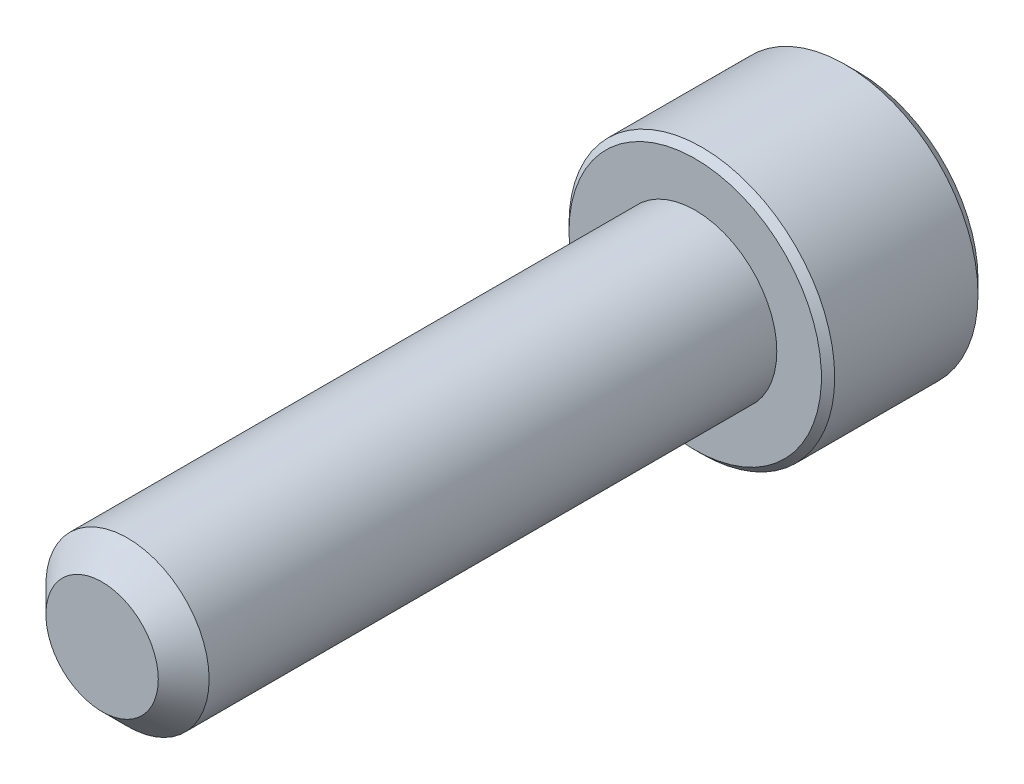
ISO-10303-21;
HEADER;
FILE_DESCRIPTION(('STEP AP214'),'2;1');
FILE_NAME('part.step','',(''),(''),'','','');
FILE_SCHEMA(('AUTOMOTIVE_DESIGN { 1 0 10303 214 1 1 1 1 }'));
ENDSEC;
DATA;
#1=APPLICATION_CONTEXT('core data for automotive mechanical design processes');
#2=APPLICATION_PROTOCOL_DEFINITION('international standard','automotive_design',2000,#1);
#3=PRODUCT_CONTEXT('',#1,'mechanical');
#4=PRODUCT('Part','Part','',(#3));
#5=PRODUCT_RELATED_PRODUCT_CATEGORY('part','',(#4));
#6=PRODUCT_DEFINITION_FORMATION('','',#4);
#7=PRODUCT_DEFINITION_CONTEXT('part definition',#1,'design');
#8=PRODUCT_DEFINITION('design','',#6,#7);
#9=PRODUCT_DEFINITION_SHAPE('','',#8);
#10=(LENGTH_UNIT() NAMED_UNIT(*) SI_UNIT(.MILLI.,.METRE.));
#11=(NAMED_UNIT(*) PLANE_ANGLE_UNIT() SI_UNIT($,.RADIAN.));
#12=(NAMED_UNIT(*) SI_UNIT($,.STERADIAN.) SOLID_ANGLE_UNIT());
#13=UNCERTAINTY_MEASURE_WITH_UNIT(LENGTH_MEASURE(1.E-05),#10,'distance_accuracy_value','');
#14=(GEOMETRIC_REPRESENTATION_CONTEXT(3) GLOBAL_UNCERTAINTY_ASSIGNED_CONTEXT((#13)) GLOBAL_UNIT_ASSIGNED_CONTEXT((#10,
#11,#12)) REPRESENTATION_CONTEXT('',''));
#15=CARTESIAN_POINT('',(0.,0.,0.));
#16=DIRECTION('',(0.,0.,1.));
#17=DIRECTION('',(1.,0.,0.));
#18=AXIS2_PLACEMENT_3D('',#15,#16,#17);
#19=CARTESIAN_POINT('',(0.,0.,-7.9375));
#20=DIRECTION('',(0.,0.,1.));
#21=DIRECTION('',(1.,0.,0.));
#22=AXIS2_PLACEMENT_3D('',#19,#20,#21);
#23=CYLINDRICAL_SURFACE('',#22,1.0922);
#24=CARTESIAN_POINT('',(0.,0.,-0.340178571428572));
#25=DIRECTION('',(0.,0.,1.));
#26=DIRECTION('',(1.,0.,0.));
#27=AXIS2_PLACEMENT_3D('',#24,#25,#26);
#28=CIRCLE('',#27,1.0922);
#29=CARTESIAN_POINT('',(1.0922,0.,-0.340178571428572));
#30=VERTEX_POINT('',#29);
#31=EDGE_CURVE('E111',#30,#30,#28,.F.);
#32=ORIENTED_EDGE('',*,*,#31,.T.);
#33=EDGE_LOOP('',(#32));
#34=FACE_BOUND('',#33,.T.);
#35=CARTESIAN_POINT('',(0.,0.,-7.9375));
#36=DIRECTION('',(0.,0.,-1.));
#37=DIRECTION('',(-1.,0.,0.));
#38=AXIS2_PLACEMENT_3D('',#35,#36,#37);
#39=CIRCLE('',#38,1.0922);
#40=CARTESIAN_POINT('',(-1.0922,0.,-7.9375));
#41=VERTEX_POINT('',#40);
#42=EDGE_CURVE('E214',#41,#41,#39,.F.);
#43=ORIENTED_EDGE('',*,*,#42,.T.);
#44=EDGE_LOOP('',(#43));
#45=FACE_BOUND('',#44,.T.);
#46=ADVANCED_FACE('F37',(#34,#45),#23,.T.);
#47=CARTESIAN_POINT('',(0.,0.,0.));
#48=DIRECTION('',(0.,0.,1.));
#49=DIRECTION('',(1.,0.,0.));
#50=AXIS2_PLACEMENT_3D('',#47,#48,#49);
#51=PLANE('',#50);
#52=CARTESIAN_POINT('',(0.,0.,0.));
#53=DIRECTION('',(0.,0.,1.));
#54=DIRECTION('',(1.,0.,0.));
#55=AXIS2_PLACEMENT_3D('',#52,#53,#54);
#56=CIRCLE('',#55,0.752021428571429);
#57=CARTESIAN_POINT('',(0.752021428571429,0.,0.));
#58=VERTEX_POINT('',#57);
#59=EDGE_CURVE('E213',#58,#58,#56,.T.);
#60=ORIENTED_EDGE('',*,*,#59,.T.);
#61=EDGE_LOOP('',(#60));
#62=FACE_BOUND('',#61,.T.);
#63=ADVANCED_FACE('F191',(#62),#51,.T.);
#64=CARTESIAN_POINT('',(0.,0.,0.));
#65=DIRECTION('',(0.,0.,-1.));
#66=DIRECTION('',(-1.,0.,0.));
#67=AXIS2_PLACEMENT_3D('',#64,#65,#66);
#68=CONICAL_SURFACE('',#67,0.752021428571429,0.785398163397447);
#69=ORIENTED_EDGE('',*,*,#31,.F.);
#70=EDGE_LOOP('',(#69));
#71=FACE_BOUND('',#70,.T.);
#72=ORIENTED_EDGE('',*,*,#59,.F.);
#73=EDGE_LOOP('',(#72));
#74=FACE_BOUND('',#73,.T.);
#75=ADVANCED_FACE('F197',(#71,#74),#68,.T.);
#76=CARTESIAN_POINT('',(0.,0.,-10.1219));
#77=DIRECTION('',(0.,0.,1.));
#78=DIRECTION('',(1.,0.,0.));
#79=AXIS2_PLACEMENT_3D('',#76,#77,#78);
#80=CYLINDRICAL_SURFACE('',#79,1.778);
#81=CARTESIAN_POINT('',(0.,0.,-8.0264));
#82=DIRECTION('',(0.,0.,-1.));
#83=DIRECTION('',(-1.,0.,0.));
#84=AXIS2_PLACEMENT_3D('',#81,#82,#83);
#85=CIRCLE('',#84,1.778);
#86=CARTESIAN_POINT('',(-1.778,0.,-8.0264));
#87=VERTEX_POINT('',#86);
#88=EDGE_CURVE('E45',#87,#87,#85,.T.);
#89=ORIENTED_EDGE('',*,*,#88,.T.);
#90=EDGE_LOOP('',(#89));
#91=FACE_BOUND('',#90,.T.);
#92=CARTESIAN_POINT('',(0.,0.,-9.9441));
#93=DIRECTION('',(0.,0.,-1.));
#94=DIRECTION('',(-1.,0.,0.));
#95=AXIS2_PLACEMENT_3D('',#92,#93,#94);
#96=CIRCLE('',#95,1.778);
#97=CARTESIAN_POINT('',(1.778,0.,-9.9441));
#98=VERTEX_POINT('',#97);
#99=EDGE_CURVE('E174',#98,#98,#96,.F.);
#100=ORIENTED_EDGE('',*,*,#99,.T.);
#101=EDGE_LOOP('',(#100));
#102=FACE_BOUND('',#101,.T.);
#103=ADVANCED_FACE('F179',(#91,#102),#80,.T.);
#104=CARTESIAN_POINT('',(0.,0.,-10.1219));
#105=DIRECTION('',(0.,0.,-1.));
#106=DIRECTION('',(-1.,0.,0.));
#107=AXIS2_PLACEMENT_3D('',#104,#105,#106);
#108=PLANE('',#107);
#109=CARTESIAN_POINT('',(0.,0.,-10.1219));
#110=DIRECTION('',(0.,0.,-1.));
#111=DIRECTION('',(-1.,0.,0.));
#112=AXIS2_PLACEMENT_3D('',#109,#110,#111);
#113=CIRCLE('',#112,1.6002);
#114=CARTESIAN_POINT('',(1.6002,0.,-10.1219));
#115=VERTEX_POINT('',#114);
#116=EDGE_CURVE('E110',#115,#115,#113,.T.);
#117=ORIENTED_EDGE('',*,*,#116,.T.);
#118=EDGE_LOOP('',(#117));
#119=FACE_BOUND('',#118,.T.);
#120=CARTESIAN_POINT('',(0.,0.,-10.1219));
#121=DIRECTION('',(0.,0.,-1.));
#122=DIRECTION('',(-1.,0.,0.));
#123=AXIS2_PLACEMENT_3D('',#120,#121,#122);
#124=CIRCLE('',#123,1.14567944042316);
#125=CARTESIAN_POINT('',(-0.9921875,0.572839720211583,-10.1219));
#126=VERTEX_POINT('',#125);
#127=CARTESIAN_POINT('',(0.,1.14567944042316,-10.1219));
#128=VERTEX_POINT('',#127);
#129=EDGE_CURVE('E91',#126,#128,#124,.T.);
#130=ORIENTED_EDGE('',*,*,#129,.F.);
#131=CARTESIAN_POINT('',(-0.9921875,-0.572839720211582,-10.1219));
#132=VERTEX_POINT('',#131);
#133=EDGE_CURVE('E51',#132,#126,#124,.T.);
#134=ORIENTED_EDGE('',*,*,#133,.F.);
#135=CARTESIAN_POINT('',(0.,-1.14567944042316,-10.1219));
#136=VERTEX_POINT('',#135);
#137=EDGE_CURVE('E273',#136,#132,#124,.T.);
#138=ORIENTED_EDGE('',*,*,#137,.F.);
#139=CARTESIAN_POINT('',(0.9921875,-0.572839720211582,-10.1219));
#140=VERTEX_POINT('',#139);
#141=EDGE_CURVE('E58',#140,#136,#124,.T.);
#142=ORIENTED_EDGE('',*,*,#141,.F.);
#143=CARTESIAN_POINT('',(0.9921875,0.572839720211582,-10.1219));
#144=VERTEX_POINT('',#143);
#145=EDGE_CURVE('E132',#144,#140,#124,.T.);
#146=ORIENTED_EDGE('',*,*,#145,.F.);
#147=EDGE_CURVE('E100',#128,#144,#124,.T.);
#148=ORIENTED_EDGE('',*,*,#147,.F.);
#149=EDGE_LOOP('',(#130,#134,#138,#142,#146,#148));
#150=FACE_BOUND('',#149,.T.);
#151=ADVANCED_FACE('F131',(#119,#150),#108,.T.);
#152=CARTESIAN_POINT('',(0.,0.,-7.9375));
#153=DIRECTION('',(0.,0.,-1.));
#154=DIRECTION('',(-1.,0.,0.));
#155=AXIS2_PLACEMENT_3D('',#152,#153,#154);
#156=PLANE('',#155);
#157=CARTESIAN_POINT('',(0.,0.,-7.9375));
#158=DIRECTION('',(0.,0.,-1.));
#159=DIRECTION('',(-1.,0.,0.));
#160=AXIS2_PLACEMENT_3D('',#157,#158,#159);
#161=CIRCLE('',#160,1.6891);
#162=CARTESIAN_POINT('',(-1.6891,0.,-7.9375));
#163=VERTEX_POINT('',#162);
#164=EDGE_CURVE('E12',#163,#163,#161,.F.);
#165=ORIENTED_EDGE('',*,*,#164,.T.);
#166=EDGE_LOOP('',(#165));
#167=FACE_BOUND('',#166,.T.);
#168=ORIENTED_EDGE('',*,*,#42,.F.);
#169=EDGE_LOOP('',(#168));
#170=FACE_BOUND('',#169,.T.);
#171=ADVANCED_FACE('F285',(#167,#170),#156,.F.);
#172=CARTESIAN_POINT('',(0.,0.,-10.1219));
#173=DIRECTION('',(0.,0.,-1.));
#174=DIRECTION('',(-1.,0.,0.));
#175=AXIS2_PLACEMENT_3D('',#172,#173,#174);
#176=CONICAL_SURFACE('',#175,1.14567944042316,0.78539816339745);
#177=ORIENTED_EDGE('',*,*,#147,.T.);
#178=CARTESIAN_POINT('',(-0.000200000000000158,1.145794910477,-10.122015487509));
#179=CARTESIAN_POINT('',(0.0339140752321556,1.12609913995856,-10.1023328114047));
#180=CARTESIAN_POINT('',(0.0685985894922791,1.10607402631377,-10.0838056845184));
#181=CARTESIAN_POINT('',(0.139324581199958,1.06524035596264,-10.0498823296504));
#182=CARTESIAN_POINT('',(0.175372791624241,1.04442791197037,-10.0345049872309));
#183=CARTESIAN_POINT('',(0.248062511737395,1.00246048249572,-10.0081631427343));
#184=CARTESIAN_POINT('',(0.2846854890132,0.981316196707013,-9.99713239651314));
#185=CARTESIAN_POINT('',(0.358737506246055,0.938562244623589,-9.98013620567294));
#186=CARTESIAN_POINT('',(0.396164282559341,0.916953885244213,-9.97415806757892));
#187=CARTESIAN_POINT('',(0.46066463860547,0.879714587318154,-9.96876634491429));
#188=CARTESIAN_POINT('',(0.487654299314528,0.864132099442443,-9.96796899638834));
#189=CARTESIAN_POINT('',(0.541581355945663,0.832997298779853,-9.96930819336142));
#190=CARTESIAN_POINT('',(0.568518739024238,0.817444993408173,-9.97144538613705));
#191=CARTESIAN_POINT('',(0.648946222958496,0.771010163908485,-9.98211757130602));
#192=CARTESIAN_POINT('',(0.702036069363281,0.740358726795446,-9.99491438072271));
#193=CARTESIAN_POINT('',(0.795214637965796,0.686562055130081,-10.0257974676501));
#194=CARTESIAN_POINT('',(0.835740306309515,0.663164549602745,-10.0422650089077));
#195=CARTESIAN_POINT('',(0.915204315708207,0.617285982385523,-10.0793603835568));
#196=CARTESIAN_POINT('',(0.954147338261523,0.594802217831308,-10.0999746806455));
#197=CARTESIAN_POINT('',(0.9923875,0.572724250157744,-10.122015487509));
#198=B_SPLINE_CURVE_WITH_KNOTS('',3,(#178,#179,#180,#181,#182,#183,#184,#185,#186,#187,#188,
#189,#190,#191,#192,#193,#194,#195,#196,#197),.UNSPECIFIED.,.F.,.F.,(4,2,2,2,2,2,2,2,2,4),(0.,
0.13219718521019,0.265165186853262,0.396020097605669,0.526545281028573,0.619935205043264,
0.713345731536163,0.900220051846368,1.04884529769095,1.1969930355767),.UNSPECIFIED.);
#199=EDGE_CURVE('E105',#128,#144,#198,.T.);
#200=ORIENTED_EDGE('',*,*,#199,.F.);
#201=EDGE_LOOP('',(#177,#200));
#202=FACE_BOUND('',#201,.T.);
#203=ADVANCED_FACE('F106',(#202),#176,.F.);
#204=ORIENTED_EDGE('',*,*,#145,.T.);
#205=CARTESIAN_POINT('',(0.9921875,-1.14247621078911,-10.4893920394083));
#206=CARTESIAN_POINT('',(0.9921875,-1.11465764801141,-10.4683916392497));
#207=CARTESIAN_POINT('',(0.9921875,-1.08668408094051,-10.4475971477058));
#208=CARTESIAN_POINT('',(0.9921875,-1.03036405365904,-10.4065050376869));
#209=CARTESIAN_POINT('',(0.9921875,-1.00201750223733,-10.3862075443571));
#210=CARTESIAN_POINT('',(0.9921875,-0.915909012346496,-10.3258985074939));
#211=CARTESIAN_POINT('',(0.9921875,-0.857501195839067,-10.2867938521726));
#212=CARTESIAN_POINT('',(0.9921875,-0.735022281240404,-10.2100267527611));
#213=CARTESIAN_POINT('',(0.9921875,-0.670818221894542,-10.1725740309963));
#214=CARTESIAN_POINT('',(0.9921875,-0.539203244212802,-10.104065020461));
#215=CARTESIAN_POINT('',(0.9921875,-0.471804118965061,-10.0729871682543));
#216=CARTESIAN_POINT('',(0.9921875,-0.370637445252798,-10.0349662962363));
#217=CARTESIAN_POINT('',(0.9921875,-0.338367677251604,-10.0240540323325));
#218=CARTESIAN_POINT('',(0.9921875,-0.273049086247197,-10.0048202300993));
#219=CARTESIAN_POINT('',(0.9921875,-0.240000209742887,-9.99649887024719));
#220=CARTESIAN_POINT('',(0.9921875,-0.173878395816095,-9.98301877368215));
#221=CARTESIAN_POINT('',(0.9921875,-0.140816774716471,-9.97780539396509));
#222=CARTESIAN_POINT('',(0.9921875,-0.0743291671992151,-9.97063971245706));
#223=CARTESIAN_POINT('',(0.9921875,-0.0409031259919584,-9.96868790803543));
#224=CARTESIAN_POINT('',(0.9921875,0.0247631141129242,-9.96819348590571));
#225=CARTESIAN_POINT('',(0.9921875,0.0570024445003658,-9.96953003142075));
#226=CARTESIAN_POINT('',(0.9921875,0.12119422050107,-9.97527104321384));
#227=CARTESIAN_POINT('',(0.9921875,0.153146730366262,-9.97967480409386));
#228=CARTESIAN_POINT('',(0.9921875,0.217090524657735,-9.99138451115969));
#229=CARTESIAN_POINT('',(0.9921875,0.249072542149664,-9.99874030243664));
#230=CARTESIAN_POINT('',(0.9921875,0.312337779758395,-10.0159630913854));
#231=CARTESIAN_POINT('',(0.9921875,0.343621058108105,-10.025829878935));
#232=CARTESIAN_POINT('',(0.9921875,0.442112983138562,-10.0606061115969));
#233=CARTESIAN_POINT('',(0.9921875,0.507919771198879,-10.0894761641508));
#234=CARTESIAN_POINT('',(0.9921875,0.636441891183644,-10.1536652099233));
#235=CARTESIAN_POINT('',(0.9921875,0.699145053961293,-10.1890073722097));
#236=CARTESIAN_POINT('',(0.9921875,0.818979830095493,-10.2619213708677));
#237=CARTESIAN_POINT('',(0.9921875,0.876233471712467,-10.2992951350485));
#238=CARTESIAN_POINT('',(0.9921875,0.960585190784996,-10.3570711119045));
#239=CARTESIAN_POINT('',(0.9921875,0.988338378424187,-10.376533487671));
#240=CARTESIAN_POINT('',(0.9921875,1.04346551341386,-10.4159729817717));
#241=CARTESIAN_POINT('',(0.9921875,1.07083956239906,-10.4359499578848));
#242=CARTESIAN_POINT('',(0.9921875,1.09805574523311,-10.4561403056427));
#243=B_SPLINE_CURVE_WITH_KNOTS('',3,(#205,#206,#207,#208,#209,#210,#211,#212,#213,#214,#215,
#216,#217,#218,#219,#220,#221,#222,#223,#224,#225,#226,#227,#228,#229,#230,#231,#232,#233,#234,
#235,#236,#237,#238,#239,#240,#241,#242),.UNSPECIFIED.,.F.,.F.,(4,2,2,2,2,2,2,2,2,2,2,2,2,2,2,2,
2,2,4),(0.,0.104563127371703,0.209152318679108,0.419927098975113,0.642732653870157,
0.864771652131277,0.966879847039378,1.06899507422301,1.16925752982867,1.26953527342201,
1.36618351686957,1.46280954049584,1.56114078094885,1.65946379566813,1.87441437168727,
2.09015003608822,2.29516517576016,2.39685303378669,2.49851308339968),.UNSPECIFIED.);
#244=EDGE_CURVE('E99',#144,#140,#243,.F.);
#245=ORIENTED_EDGE('',*,*,#244,.F.);
#246=EDGE_LOOP('',(#204,#245));
#247=FACE_BOUND('',#246,.T.);
#248=ADVANCED_FACE('F279',(#247),#176,.F.);
#249=ORIENTED_EDGE('',*,*,#141,.T.);
#250=CARTESIAN_POINT('',(0.9923875,-0.572724250157744,-10.122015487509));
#251=CARTESIAN_POINT('',(0.958273424767844,-0.592420020676184,-10.1023328114047));
#252=CARTESIAN_POINT('',(0.923588910507721,-0.612445134320978,-10.0838056845184));
#253=CARTESIAN_POINT('',(0.852862918800041,-0.65327880467211,-10.0498823296504));
#254=CARTESIAN_POINT('',(0.816814708375758,-0.674091248664374,-10.0345049872309));
#255=CARTESIAN_POINT('',(0.744124988262605,-0.716058678139022,-10.0081631427343));
#256=CARTESIAN_POINT('',(0.707502010986799,-0.737202963927734,-9.99713239651314));
#257=CARTESIAN_POINT('',(0.633449993753944,-0.779956916011157,-9.98013620567294));
#258=CARTESIAN_POINT('',(0.596023217440658,-0.801565275390533,-9.97415806757892));
#259=CARTESIAN_POINT('',(0.53152286139453,-0.838804573316592,-9.96876634491429));
#260=CARTESIAN_POINT('',(0.504533200685471,-0.854387061192303,-9.96796899638834));
#261=CARTESIAN_POINT('',(0.450606144054336,-0.885521861854893,-9.96930819336142));
#262=CARTESIAN_POINT('',(0.423668760975761,-0.901074167226573,-9.97144538613705));
#263=CARTESIAN_POINT('',(0.343241277041503,-0.947508996726261,-9.98211757130602));
#264=CARTESIAN_POINT('',(0.290151430636718,-0.9781604338393,-9.99491438072271));
#265=CARTESIAN_POINT('',(0.196972862034203,-1.03195710550467,-10.0257974676501));
#266=CARTESIAN_POINT('',(0.156447193690484,-1.055354611032,-10.0422650089077));
#267=CARTESIAN_POINT('',(0.0769831842917936,-1.10123317824922,-10.0793603835568));
#268=CARTESIAN_POINT('',(0.0380401617384773,-1.12371694280344,-10.0999746806455));
#269=CARTESIAN_POINT('',(-0.000199999999999378,-1.145794910477,-10.122015487509));
#270=B_SPLINE_CURVE_WITH_KNOTS('',3,(#250,#251,#252,#253,#254,#255,#256,#257,#258,#259,#260,
#261,#262,#263,#264,#265,#266,#267,#268,#269),.UNSPECIFIED.,.F.,.F.,(4,2,2,2,2,2,2,2,2,4),(0.,
0.132197185210189,0.265165186853262,0.396020097605669,0.526545281028573,0.619935205043264,
0.713345731536164,0.900220051846369,1.04884529769095,1.19699303557669),.UNSPECIFIED.);
#271=EDGE_CURVE('E142',#140,#136,#270,.T.);
#272=ORIENTED_EDGE('',*,*,#271,.F.);
#273=EDGE_LOOP('',(#249,#272));
#274=FACE_BOUND('',#273,.T.);
#275=ADVANCED_FACE('F276',(#274),#176,.F.);
#276=ORIENTED_EDGE('',*,*,#137,.T.);
#277=CARTESIAN_POINT('',(0.000199999999999847,-1.145794910477,-10.122015487509));
#278=CARTESIAN_POINT('',(-0.0339140752321565,-1.12609913995856,-10.1023328114047));
#279=CARTESIAN_POINT('',(-0.0685985894922804,-1.10607402631377,-10.0838056845184));
#280=CARTESIAN_POINT('',(-0.13932458119996,-1.06524035596263,-10.0498823296504));
#281=CARTESIAN_POINT('',(-0.175372791624243,-1.04442791197037,-10.0345049872309));
#282=CARTESIAN_POINT('',(-0.248062511737396,-1.00246048249572,-10.0081631427343));
#283=CARTESIAN_POINT('',(-0.284685489013202,-0.981316196707011,-9.99713239651314));
#284=CARTESIAN_POINT('',(-0.358737506246057,-0.938562244623587,-9.98013620567294));
#285=CARTESIAN_POINT('',(-0.396164282559343,-0.916953885244212,-9.97415806757892));
#286=CARTESIAN_POINT('',(-0.460664638605471,-0.879714587318153,-9.96876634491429));
#287=CARTESIAN_POINT('',(-0.48765429931453,-0.864132099442441,-9.96796899638834));
#288=CARTESIAN_POINT('',(-0.541581355945665,-0.832997298779852,-9.96930819336142));
#289=CARTESIAN_POINT('',(-0.56851873902424,-0.817444993408172,-9.97144538613705));
#290=CARTESIAN_POINT('',(-0.648946222958498,-0.771010163908484,-9.98211757130602));
#291=CARTESIAN_POINT('',(-0.702036069363283,-0.740358726795445,-9.99491438072271));
#292=CARTESIAN_POINT('',(-0.795214637965798,-0.686562055130079,-10.0257974676501));
#293=CARTESIAN_POINT('',(-0.835740306309517,-0.663164549602744,-10.0422650089077));
#294=CARTESIAN_POINT('',(-0.915204315708208,-0.617285982385523,-10.0793603835568));
#295=CARTESIAN_POINT('',(-0.954147338261524,-0.594802217831308,-10.0999746806455));
#296=CARTESIAN_POINT('',(-0.9923875,-0.572724250157744,-10.122015487509));
#297=B_SPLINE_CURVE_WITH_KNOTS('',3,(#277,#278,#279,#280,#281,#282,#283,#284,#285,#286,#287,
#288,#289,#290,#291,#292,#293,#294,#295,#296),.UNSPECIFIED.,.F.,.F.,(4,2,2,2,2,2,2,2,2,4),(0.,
0.132197185210191,0.265165186853263,0.396020097605669,0.526545281028574,0.619935205043265,
0.713345731536164,0.900220051846369,1.04884529769095,1.1969930355767),.UNSPECIFIED.);
#298=EDGE_CURVE('E250',#136,#132,#297,.T.);
#299=ORIENTED_EDGE('',*,*,#298,.F.);
#300=EDGE_LOOP('',(#276,#299));
#301=FACE_BOUND('',#300,.T.);
#302=ADVANCED_FACE('F275',(#301),#176,.F.);
#303=ORIENTED_EDGE('',*,*,#133,.T.);
#304=CARTESIAN_POINT('',(-0.9921875,-1.14247621095534,-10.4893920395338));
#305=CARTESIAN_POINT('',(-0.9921875,-1.11465764817297,-10.4683916393704));
#306=CARTESIAN_POINT('',(-0.9921875,-1.08668408109739,-10.4475971478216));
#307=CARTESIAN_POINT('',(-0.9921875,-1.03036405380652,-10.4065050377931));
#308=CARTESIAN_POINT('',(-0.9921875,-1.00201750238008,-10.3862075444585));
#309=CARTESIAN_POINT('',(-0.9921875,-0.915909012474785,-10.3258985075809));
#310=CARTESIAN_POINT('',(-0.9921875,-0.857501195957519,-10.28679385225));
#311=CARTESIAN_POINT('',(-0.9921875,-0.735022281337406,-10.2100267528187));
#312=CARTESIAN_POINT('',(-0.9921875,-0.670818221979873,-10.1725740310437));
#313=CARTESIAN_POINT('',(-0.9921875,-0.539203244273796,-10.1040650204898));
#314=CARTESIAN_POINT('',(-0.9921875,-0.471804119013399,-10.0729871682744));
#315=CARTESIAN_POINT('',(-0.9921875,-0.370637445291612,-10.03496629625));
#316=CARTESIAN_POINT('',(-0.9921875,-0.338367677294406,-10.0240540323464));
#317=CARTESIAN_POINT('',(-0.9921875,-0.273049086298105,-10.004820230113));
#318=CARTESIAN_POINT('',(-0.9921875,-0.240000209797913,-9.99649887026028));
#319=CARTESIAN_POINT('',(-0.9921875,-0.17387839587922,-9.98301877369319));
#320=CARTESIAN_POINT('',(-0.9921875,-0.140816774783575,-9.97780539397466));
#321=CARTESIAN_POINT('',(-0.9921875,-0.0743291672741469,-9.97063971246279));
#322=CARTESIAN_POINT('',(-0.9921875,-0.0409031260707386,-9.9686879080388));
#323=CARTESIAN_POINT('',(-0.9921875,0.0247631140270446,-9.96819348590368));
#324=CARTESIAN_POINT('',(-0.9921875,0.0570024444112251,-9.96953003141573));
#325=CARTESIAN_POINT('',(-0.9921875,0.121194220405733,-9.97527104320236));
#326=CARTESIAN_POINT('',(-0.9921875,0.15314673026799,-9.97967480407893));
#327=CARTESIAN_POINT('',(-0.9921875,0.21709052455367,-9.99138451113751));
#328=CARTESIAN_POINT('',(-0.9921875,0.249072542042748,-9.99874030241065));
#329=CARTESIAN_POINT('',(-0.9921875,0.312337779646054,-10.0159630913517));
#330=CARTESIAN_POINT('',(-0.9921875,0.343621057993189,-10.0258298788974));
#331=CARTESIAN_POINT('',(-0.992187499999999,0.442112982998623,-10.0606061115409));
#332=CARTESIAN_POINT('',(-0.9921875,0.507919771037746,-10.089476164078));
#333=CARTESIAN_POINT('',(-0.9921875,0.63644189098175,-10.1536652098148));
#334=CARTESIAN_POINT('',(-0.9921875,0.699145053739843,-10.1890073720824));
#335=CARTESIAN_POINT('',(-0.9921875,0.818979829838882,-10.2619213707045));
#336=CARTESIAN_POINT('',(-0.992187499999999,0.876233471440127,-10.2992951348683));
#337=CARTESIAN_POINT('',(-0.992187499999999,0.960585190489399,-10.3570711116989));
#338=CARTESIAN_POINT('',(-0.992187499999999,0.988338378120948,-10.376533487457));
#339=CARTESIAN_POINT('',(-0.992187499999999,1.04346551309539,-10.4159729815409));
#340=CARTESIAN_POINT('',(-0.992187499999999,1.07083956207299,-10.4359499576456));
#341=CARTESIAN_POINT('',(-0.992187499999999,1.09805574489947,-10.4561403053952));
#342=B_SPLINE_CURVE_WITH_KNOTS('',3,(#304,#305,#306,#307,#308,#309,#310,#311,#312,#313,#314,
#315,#316,#317,#318,#319,#320,#321,#322,#323,#324,#325,#326,#327,#328,#329,#330,#331,#332,#333,
#334,#335,#336,#337,#338,#339,#340,#341),.UNSPECIFIED.,.F.,.F.,(4,2,2,2,2,2,2,2,2,2,2,2,2,2,2,2,
2,2,4),(0.,0.104563127391605,0.209152318718919,0.419927099055485,0.642732653996012,
0.864771652302187,0.966879847198757,1.06899507437088,1.1692575299655,1.2695352735478,
1.36618351698525,1.4628095406014,1.56114078104352,1.65946379575192,1.87441437169281,
2.090150036015,2.29516517561955,2.39685303361284,2.4985130831926),.UNSPECIFIED.);
#343=EDGE_CURVE('E121',#132,#126,#342,.T.);
#344=ORIENTED_EDGE('',*,*,#343,.F.);
#345=EDGE_LOOP('',(#303,#344));
#346=FACE_BOUND('',#345,.T.);
#347=ADVANCED_FACE('F292',(#346),#176,.F.);
#348=ORIENTED_EDGE('',*,*,#129,.T.);
#349=CARTESIAN_POINT('',(-0.992387499999999,0.572724250157745,-10.122015487509));
#350=CARTESIAN_POINT('',(-0.958273424767844,0.592420020676185,-10.1023328114047));
#351=CARTESIAN_POINT('',(-0.92358891050772,0.612445134320978,-10.0838056845184));
#352=CARTESIAN_POINT('',(-0.852862918800041,0.65327880467211,-10.0498823296504));
#353=CARTESIAN_POINT('',(-0.816814708375758,0.674091248664374,-10.0345049872309));
#354=CARTESIAN_POINT('',(-0.744124988262605,0.716058678139022,-10.0081631427343));
#355=CARTESIAN_POINT('',(-0.707502010986799,0.737202963927734,-9.99713239651314));
#356=CARTESIAN_POINT('',(-0.633449993753944,0.779956916011157,-9.98013620567294));
#357=CARTESIAN_POINT('',(-0.596023217440658,0.801565275390533,-9.97415806757892));
#358=CARTESIAN_POINT('',(-0.53152286139453,0.838804573316592,-9.96876634491429));
#359=CARTESIAN_POINT('',(-0.504533200685471,0.854387061192303,-9.96796899638834));
#360=CARTESIAN_POINT('',(-0.450606144054337,0.885521861854893,-9.96930819336142));
#361=CARTESIAN_POINT('',(-0.423668760975761,0.901074167226573,-9.97144538613705));
#362=CARTESIAN_POINT('',(-0.343241277041504,0.947508996726261,-9.98211757130602));
#363=CARTESIAN_POINT('',(-0.290151430636718,0.9781604338393,-9.99491438072271));
#364=CARTESIAN_POINT('',(-0.196972862034203,1.03195710550467,-10.0257974676501));
#365=CARTESIAN_POINT('',(-0.156447193690484,1.055354611032,-10.0422650089077));
#366=CARTESIAN_POINT('',(-0.076983184291793,1.10123317824922,-10.0793603835568));
#367=CARTESIAN_POINT('',(-0.0380401617384765,1.12371694280344,-10.0999746806455));
#368=CARTESIAN_POINT('',(0.000200000000000236,1.145794910477,-10.122015487509));
#369=B_SPLINE_CURVE_WITH_KNOTS('',3,(#349,#350,#351,#352,#353,#354,#355,#356,#357,#358,#359,
#360,#361,#362,#363,#364,#365,#366,#367,#368),.UNSPECIFIED.,.F.,.F.,(4,2,2,2,2,2,2,2,2,4),(0.,
0.132197185210189,0.265165186853261,0.396020097605668,0.526545281028572,0.619935205043262,
0.713345731536162,0.900220051846367,1.04884529769095,1.19699303557669),.UNSPECIFIED.);
#370=EDGE_CURVE('E95',#126,#128,#369,.T.);
#371=ORIENTED_EDGE('',*,*,#370,.F.);
#372=EDGE_LOOP('',(#348,#371));
#373=FACE_BOUND('',#372,.T.);
#374=ADVANCED_FACE('F93',(#373),#176,.F.);
#375=CARTESIAN_POINT('',(0.9921875,1.71851916063475,-8.63361875));
#376=DIRECTION('',(0.,0.,-1.));
#377=DIRECTION('',(-1.,0.,0.));
#378=AXIS2_PLACEMENT_3D('',#375,#376,#377);
#379=PLANE('',#378);
#380=DIRECTION('',(0.866025403784439,0.5,0.));
#381=VECTOR('',#380,1.);
#382=CARTESIAN_POINT('',(-0.9921875,0.572839720211582,-8.63361875));
#383=LINE('',#382,#381);
#384=CARTESIAN_POINT('',(-0.9921875,0.572839720211582,-8.63361875));
#385=VERTEX_POINT('',#384);
#386=CARTESIAN_POINT('',(0.,1.14567944042316,-8.63361875));
#387=VERTEX_POINT('',#386);
#388=EDGE_CURVE('E120',#385,#387,#383,.T.);
#389=ORIENTED_EDGE('',*,*,#388,.T.);
#390=DIRECTION('',(0.866025403784439,-0.5,0.));
#391=VECTOR('',#390,1.);
#392=CARTESIAN_POINT('',(0.,1.14567944042316,-8.63361875));
#393=LINE('',#392,#391);
#394=CARTESIAN_POINT('',(0.9921875,0.572839720211582,-8.63361875));
#395=VERTEX_POINT('',#394);
#396=EDGE_CURVE('E125',#387,#395,#393,.T.);
#397=ORIENTED_EDGE('',*,*,#396,.T.);
#398=DIRECTION('',(0.,-1.,0.));
#399=VECTOR('',#398,1.);
#400=CARTESIAN_POINT('',(0.9921875,0.572839720211582,-8.63361875));
#401=LINE('',#400,#399);
#402=CARTESIAN_POINT('',(0.9921875,-0.572839720211582,-8.63361875));
#403=VERTEX_POINT('',#402);
#404=EDGE_CURVE('E236',#395,#403,#401,.T.);
#405=ORIENTED_EDGE('',*,*,#404,.T.);
#406=DIRECTION('',(-0.866025403784439,-0.5,0.));
#407=VECTOR('',#406,1.);
#408=CARTESIAN_POINT('',(0.9921875,-0.572839720211582,-8.63361875));
#409=LINE('',#408,#407);
#410=CARTESIAN_POINT('',(0.,-1.14567944042316,-8.63361875));
#411=VERTEX_POINT('',#410);
#412=EDGE_CURVE('E233',#403,#411,#409,.T.);
#413=ORIENTED_EDGE('',*,*,#412,.T.);
#414=DIRECTION('',(-0.866025403784439,0.5,0.));
#415=VECTOR('',#414,1.);
#416=CARTESIAN_POINT('',(0.,-1.14567944042316,-8.63361875));
#417=LINE('',#416,#415);
#418=CARTESIAN_POINT('',(-0.9921875,-0.572839720211582,-8.63361875));
#419=VERTEX_POINT('',#418);
#420=EDGE_CURVE('E230',#411,#419,#417,.T.);
#421=ORIENTED_EDGE('',*,*,#420,.T.);
#422=DIRECTION('',(0.,1.,0.));
#423=VECTOR('',#422,1.);
#424=CARTESIAN_POINT('',(-0.9921875,-0.572839720211582,-8.63361875));
#425=LINE('',#424,#423);
#426=EDGE_CURVE('E128',#419,#385,#425,.T.);
#427=ORIENTED_EDGE('',*,*,#426,.T.);
#428=EDGE_LOOP('',(#389,#397,#405,#413,#421,#427));
#429=FACE_BOUND('',#428,.T.);
#430=ADVANCED_FACE('F162',(#429),#379,.T.);
#431=CARTESIAN_POINT('',(0.,1.14567944042316,-8.63361875));
#432=DIRECTION('',(0.5,0.866025403784439,0.));
#433=DIRECTION('',(-0.866025403784439,0.5,0.));
#434=AXIS2_PLACEMENT_3D('',#431,#432,#433);
#435=PLANE('',#434);
#436=DIRECTION('',(0.,0.,-1.));
#437=VECTOR('',#436,1.);
#438=CARTESIAN_POINT('',(0.,1.14567944042316,-8.63361875));
#439=LINE('',#438,#437);
#440=EDGE_CURVE('E117',#387,#128,#439,.T.);
#441=ORIENTED_EDGE('',*,*,#440,.T.);
#442=ORIENTED_EDGE('',*,*,#199,.T.);
#443=DIRECTION('',(0.,0.,-1.));
#444=VECTOR('',#443,1.);
#445=CARTESIAN_POINT('',(0.9921875,0.572839720211582,-8.63361875));
#446=LINE('',#445,#444);
#447=EDGE_CURVE('E127',#395,#144,#446,.T.);
#448=ORIENTED_EDGE('',*,*,#447,.F.);
#449=ORIENTED_EDGE('',*,*,#396,.F.);
#450=EDGE_LOOP('',(#441,#442,#448,#449));
#451=FACE_BOUND('',#450,.T.);
#452=ADVANCED_FACE('F123',(#451),#435,.F.);
#453=CARTESIAN_POINT('',(0.9921875,0.572839720211582,-8.63361875));
#454=DIRECTION('',(1.,0.,0.));
#455=DIRECTION('',(0.,0.,-1.));
#456=AXIS2_PLACEMENT_3D('',#453,#454,#455);
#457=PLANE('',#456);
#458=ORIENTED_EDGE('',*,*,#447,.T.);
#459=ORIENTED_EDGE('',*,*,#244,.T.);
#460=DIRECTION('',(0.,0.,-1.));
#461=VECTOR('',#460,1.);
#462=CARTESIAN_POINT('',(0.9921875,-0.572839720211582,-8.63361875));
#463=LINE('',#462,#461);
#464=EDGE_CURVE('E219',#403,#140,#463,.T.);
#465=ORIENTED_EDGE('',*,*,#464,.F.);
#466=ORIENTED_EDGE('',*,*,#404,.F.);
#467=EDGE_LOOP('',(#458,#459,#465,#466));
#468=FACE_BOUND('',#467,.T.);
#469=ADVANCED_FACE('F151',(#468),#457,.F.);
#470=CARTESIAN_POINT('',(0.9921875,-0.572839720211582,-8.63361875));
#471=DIRECTION('',(0.5,-0.866025403784439,0.));
#472=DIRECTION('',(0.866025403784439,0.5,0.));
#473=AXIS2_PLACEMENT_3D('',#470,#471,#472);
#474=PLANE('',#473);
#475=ORIENTED_EDGE('',*,*,#464,.T.);
#476=ORIENTED_EDGE('',*,*,#271,.T.);
#477=DIRECTION('',(0.,0.,-1.));
#478=VECTOR('',#477,1.);
#479=CARTESIAN_POINT('',(0.,-1.14567944042316,-8.63361875));
#480=LINE('',#479,#478);
#481=EDGE_CURVE('E222',#411,#136,#480,.T.);
#482=ORIENTED_EDGE('',*,*,#481,.F.);
#483=ORIENTED_EDGE('',*,*,#412,.F.);
#484=EDGE_LOOP('',(#475,#476,#482,#483));
#485=FACE_BOUND('',#484,.T.);
#486=ADVANCED_FACE('F155',(#485),#474,.F.);
#487=CARTESIAN_POINT('',(0.,-1.14567944042316,-8.63361875));
#488=DIRECTION('',(-0.5,-0.866025403784439,0.));
#489=DIRECTION('',(0.866025403784439,-0.5,0.));
#490=AXIS2_PLACEMENT_3D('',#487,#488,#489);
#491=PLANE('',#490);
#492=ORIENTED_EDGE('',*,*,#481,.T.);
#493=ORIENTED_EDGE('',*,*,#298,.T.);
#494=DIRECTION('',(0.,0.,-1.));
#495=VECTOR('',#494,1.);
#496=CARTESIAN_POINT('',(-0.9921875,-0.572839720211582,-8.63361875));
#497=LINE('',#496,#495);
#498=EDGE_CURVE('E225',#419,#132,#497,.T.);
#499=ORIENTED_EDGE('',*,*,#498,.F.);
#500=ORIENTED_EDGE('',*,*,#420,.F.);
#501=EDGE_LOOP('',(#492,#493,#499,#500));
#502=FACE_BOUND('',#501,.T.);
#503=ADVANCED_FACE('F258',(#502),#491,.F.);
#504=CARTESIAN_POINT('',(-0.9921875,-0.572839720211582,-8.63361875));
#505=DIRECTION('',(-1.,0.,0.));
#506=DIRECTION('',(0.,-1.,0.));
#507=AXIS2_PLACEMENT_3D('',#504,#505,#506);
#508=PLANE('',#507);
#509=ORIENTED_EDGE('',*,*,#498,.T.);
#510=ORIENTED_EDGE('',*,*,#343,.T.);
#511=DIRECTION('',(0.,0.,-1.));
#512=VECTOR('',#511,1.);
#513=CARTESIAN_POINT('',(-0.9921875,0.572839720211582,-8.63361875));
#514=LINE('',#513,#512);
#515=EDGE_CURVE('E119',#385,#126,#514,.T.);
#516=ORIENTED_EDGE('',*,*,#515,.F.);
#517=ORIENTED_EDGE('',*,*,#426,.F.);
#518=EDGE_LOOP('',(#509,#510,#516,#517));
#519=FACE_BOUND('',#518,.T.);
#520=ADVANCED_FACE('F255',(#519),#508,.F.);
#521=CARTESIAN_POINT('',(-0.9921875,0.572839720211582,-8.63361875));
#522=DIRECTION('',(-0.5,0.866025403784439,0.));
#523=DIRECTION('',(-0.866025403784439,-0.5,0.));
#524=AXIS2_PLACEMENT_3D('',#521,#522,#523);
#525=PLANE('',#524);
#526=ORIENTED_EDGE('',*,*,#515,.T.);
#527=ORIENTED_EDGE('',*,*,#370,.T.);
#528=ORIENTED_EDGE('',*,*,#440,.F.);
#529=ORIENTED_EDGE('',*,*,#388,.F.);
#530=EDGE_LOOP('',(#526,#527,#528,#529));
#531=FACE_BOUND('',#530,.T.);
#532=ADVANCED_FACE('F115',(#531),#525,.F.);
#533=CARTESIAN_POINT('',(0.,0.,-10.1219));
#534=DIRECTION('',(0.,0.,1.));
#535=DIRECTION('',(1.,0.,0.));
#536=AXIS2_PLACEMENT_3D('',#533,#534,#535);
#537=CONICAL_SURFACE('',#536,1.6002,0.785398163397443);
#538=CARTESIAN_POINT('',(1.778,0.,-9.9441));
#539=CARTESIAN_POINT('',(1.77614791666667,0.,-9.94595208333333));
#540=CARTESIAN_POINT('',(1.77429583333333,0.,-9.94780416666666));
#541=CARTESIAN_POINT('',(1.77059166666667,0.,-9.95150833333333));
#542=CARTESIAN_POINT('',(1.76873958333333,0.,-9.95336041666666));
#543=CARTESIAN_POINT('',(1.76503541666667,0.,-9.95706458333333));
#544=CARTESIAN_POINT('',(1.76318333333333,0.,-9.95891666666666));
#545=CARTESIAN_POINT('',(1.75947916666667,0.,-9.96262083333333));
#546=CARTESIAN_POINT('',(1.75762708333333,0.,-9.96447291666666));
#547=CARTESIAN_POINT('',(1.75392291666667,0.,-9.96817708333333));
#548=CARTESIAN_POINT('',(1.75207083333333,0.,-9.97002916666666));
#549=CARTESIAN_POINT('',(1.74836666666667,0.,-9.97373333333333));
#550=CARTESIAN_POINT('',(1.74651458333333,0.,-9.97558541666666));
#551=CARTESIAN_POINT('',(1.74281041666667,0.,-9.97928958333333));
#552=CARTESIAN_POINT('',(1.74095833333333,0.,-9.98114166666666));
#553=CARTESIAN_POINT('',(1.73725416666667,0.,-9.98484583333333));
#554=CARTESIAN_POINT('',(1.73540208333333,0.,-9.98669791666666));
#555=CARTESIAN_POINT('',(1.73169791666667,0.,-9.99040208333333));
#556=CARTESIAN_POINT('',(1.72984583333333,0.,-9.99225416666666));
#557=CARTESIAN_POINT('',(1.72614166666667,0.,-9.99595833333333));
#558=CARTESIAN_POINT('',(1.72428958333333,0.,-9.99781041666666));
#559=CARTESIAN_POINT('',(1.72058541666667,0.,-10.0015145833333));
#560=CARTESIAN_POINT('',(1.71873333333333,0.,-10.0033666666667));
#561=CARTESIAN_POINT('',(1.71502916666667,0.,-10.0070708333333));
#562=CARTESIAN_POINT('',(1.71317708333333,0.,-10.0089229166667));
#563=CARTESIAN_POINT('',(1.70947291666667,0.,-10.0126270833333));
#564=CARTESIAN_POINT('',(1.70762083333333,0.,-10.0144791666667));
#565=CARTESIAN_POINT('',(1.70391666666667,0.,-10.0181833333333));
#566=CARTESIAN_POINT('',(1.70206458333333,0.,-10.0200354166667));
#567=CARTESIAN_POINT('',(1.69836041666667,0.,-10.0237395833333));
#568=CARTESIAN_POINT('',(1.69650833333333,0.,-10.0255916666667));
#569=CARTESIAN_POINT('',(1.69280416666667,0.,-10.0292958333333));
#570=CARTESIAN_POINT('',(1.69095208333333,0.,-10.0311479166667));
#571=CARTESIAN_POINT('',(1.68724791666667,0.,-10.0348520833333));
#572=CARTESIAN_POINT('',(1.68539583333333,0.,-10.0367041666667));
#573=CARTESIAN_POINT('',(1.68169166666667,0.,-10.0404083333333));
#574=CARTESIAN_POINT('',(1.67983958333333,0.,-10.0422604166667));
#575=CARTESIAN_POINT('',(1.67613541666667,0.,-10.0459645833333));
#576=CARTESIAN_POINT('',(1.67428333333333,0.,-10.0478166666667));
#577=CARTESIAN_POINT('',(1.67057916666667,0.,-10.0515208333333));
#578=CARTESIAN_POINT('',(1.66872708333333,0.,-10.0533729166667));
#579=CARTESIAN_POINT('',(1.66502291666667,0.,-10.0570770833333));
#580=CARTESIAN_POINT('',(1.66317083333333,0.,-10.0589291666667));
#581=CARTESIAN_POINT('',(1.65946666666667,0.,-10.0626333333333));
#582=CARTESIAN_POINT('',(1.65761458333333,0.,-10.0644854166667));
#583=CARTESIAN_POINT('',(1.65391041666667,0.,-10.0681895833333));
#584=CARTESIAN_POINT('',(1.65205833333333,0.,-10.0700416666667));
#585=CARTESIAN_POINT('',(1.64835416666667,0.,-10.0737458333333));
#586=CARTESIAN_POINT('',(1.64650208333333,0.,-10.0755979166667));
#587=CARTESIAN_POINT('',(1.64279791666667,0.,-10.0793020833333));
#588=CARTESIAN_POINT('',(1.64094583333333,0.,-10.0811541666667));
#589=CARTESIAN_POINT('',(1.63724166666667,0.,-10.0848583333333));
#590=CARTESIAN_POINT('',(1.63538958333333,0.,-10.0867104166667));
#591=CARTESIAN_POINT('',(1.63168541666667,0.,-10.0904145833333));
#592=CARTESIAN_POINT('',(1.62983333333333,0.,-10.0922666666667));
#593=CARTESIAN_POINT('',(1.62612916666667,0.,-10.0959708333333));
#594=CARTESIAN_POINT('',(1.62427708333333,0.,-10.0978229166667));
#595=CARTESIAN_POINT('',(1.62057291666667,0.,-10.1015270833333));
#596=CARTESIAN_POINT('',(1.61872083333333,0.,-10.1033791666667));
#597=CARTESIAN_POINT('',(1.61501666666667,0.,-10.1070833333333));
#598=CARTESIAN_POINT('',(1.61316458333333,0.,-10.1089354166667));
#599=CARTESIAN_POINT('',(1.60946041666667,0.,-10.1126395833333));
#600=CARTESIAN_POINT('',(1.60760833333333,0.,-10.1144916666667));
#601=CARTESIAN_POINT('',(1.60390416666667,0.,-10.1181958333333));
#602=CARTESIAN_POINT('',(1.60205208333333,0.,-10.1200479166667));
#603=CARTESIAN_POINT('',(1.6002,0.,-10.1219));
#604=B_SPLINE_CURVE_WITH_KNOTS('',3,(#538,#539,#540,#541,#542,#543,#544,#545,#546,#547,#548,
#549,#550,#551,#552,#553,#554,#555,#556,#557,#558,#559,#560,#561,#562,#563,#564,#565,#566,#567,
#568,#569,#570,#571,#572,#573,#574,#575,#576,#577,#578,#579,#580,#581,#582,#583,#584,#585,#586,
#587,#588,#589,#590,#591,#592,#593,#594,#595,#596,#597,#598,#599,#600,#601,#602,#603),
.UNSPECIFIED.,.F.,.F.,(4,2,2,2,2,2,2,2,2,2,2,2,2,2,2,2,2,2,2,2,2,2,2,2,2,2,2,2,2,2,2,2,4),(0.,
0.00785772410593561,0.0157154482118712,0.0235731723178068,0.0314308964237426,0.0392886205296782,
0.0471463446356138,0.0550040687415494,0.0628617928474852,0.0707195169534208,0.0785772410593564,
0.086434965165292,0.0942926892712276,0.102150413377163,0.110008137483099,0.117865861589035,
0.125723585694969,0.133581309800905,0.14143903390684,0.149296758012776,0.157154482118712,
0.165012206224647,0.172869930330583,0.180727654436519,0.188585378542454,0.19644310264839,
0.204300826754326,0.212158550860261,0.220016274966197,0.227873999072132,0.235731723178068,
0.243589447284004,0.251447171389939),.UNSPECIFIED.);
#605=EDGE_CURVE('BSEAM183',#98,#115,#604,.T.);
#606=ORIENTED_EDGE('',*,*,#99,.F.);
#607=ORIENTED_EDGE('',*,*,#116,.F.);
#608=ORIENTED_EDGE('',*,*,#605,.T.);
#609=ORIENTED_EDGE('',*,*,#605,.F.);
#610=EDGE_LOOP('',(#606,#608,#607,#609));
#611=FACE_BOUND('',#610,.T.);
#612=ADVANCED_FACE('F183',(#611),#537,.T.);
#613=CARTESIAN_POINT('',(0.,0.,-8.0264));
#614=DIRECTION('',(0.,0.,-1.));
#615=DIRECTION('',(-1.,0.,0.));
#616=AXIS2_PLACEMENT_3D('',#613,#614,#615);
#617=CONICAL_SURFACE('',#616,1.778,0.785398163397445);
#618=ORIENTED_EDGE('',*,*,#164,.F.);
#619=EDGE_LOOP('',(#618));
#620=FACE_BOUND('',#619,.T.);
#621=ORIENTED_EDGE('',*,*,#88,.F.);
#622=EDGE_LOOP('',(#621));
#623=FACE_BOUND('',#622,.T.);
#624=ADVANCED_FACE('F39',(#620,#623),#617,.T.);
#625=CLOSED_SHELL('',(#46,#63,#75,#103,#151,#171,#203,#248,#275,#302,#347,#374,#430,#452,#469,
#486,#503,#520,#532,#612,#624));
#626=MANIFOLD_SOLID_BREP('B2',#625);
#627=ADVANCED_BREP_SHAPE_REPRESENTATION('',(#18,#626),#14);
#628=SHAPE_DEFINITION_REPRESENTATION(#9,#627);
ENDSEC;
END-ISO-10303-21;
